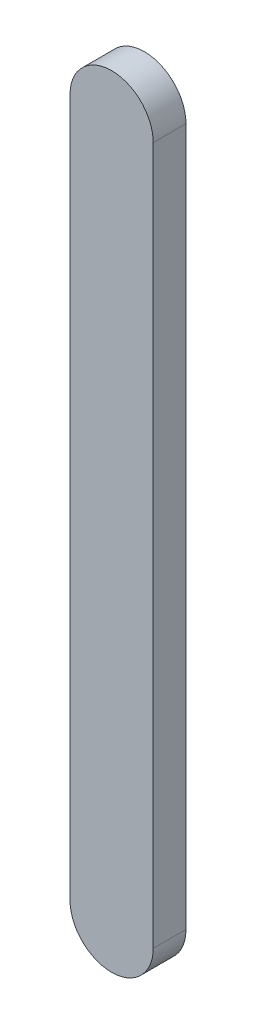
ISO-10303-21;
HEADER;
FILE_DESCRIPTION(('STEP AP214'),'2;1');
FILE_NAME('part.step','',(''),(''),'','','');
FILE_SCHEMA(('AUTOMOTIVE_DESIGN { 1 0 10303 214 1 1 1 1 }'));
ENDSEC;
DATA;
#1=APPLICATION_CONTEXT('core data for automotive mechanical design processes');
#2=APPLICATION_PROTOCOL_DEFINITION('international standard','automotive_design',2000,#1);
#3=PRODUCT_CONTEXT('',#1,'mechanical');
#4=PRODUCT('Part','Part','',(#3));
#5=PRODUCT_RELATED_PRODUCT_CATEGORY('part','',(#4));
#6=PRODUCT_DEFINITION_FORMATION('','',#4);
#7=PRODUCT_DEFINITION_CONTEXT('part definition',#1,'design');
#8=PRODUCT_DEFINITION('design','',#6,#7);
#9=PRODUCT_DEFINITION_SHAPE('','',#8);
#10=(LENGTH_UNIT() NAMED_UNIT(*) SI_UNIT(.MILLI.,.METRE.));
#11=(NAMED_UNIT(*) PLANE_ANGLE_UNIT() SI_UNIT($,.RADIAN.));
#12=(NAMED_UNIT(*) SI_UNIT($,.STERADIAN.) SOLID_ANGLE_UNIT());
#13=UNCERTAINTY_MEASURE_WITH_UNIT(LENGTH_MEASURE(1.E-05),#10,'distance_accuracy_value','');
#14=(GEOMETRIC_REPRESENTATION_CONTEXT(3) GLOBAL_UNCERTAINTY_ASSIGNED_CONTEXT((#13)) GLOBAL_UNIT_ASSIGNED_CONTEXT((#10,
#11,#12)) REPRESENTATION_CONTEXT('',''));
#15=CARTESIAN_POINT('',(0.,0.,0.));
#16=DIRECTION('',(0.,0.,1.));
#17=DIRECTION('',(1.,0.,0.));
#18=AXIS2_PLACEMENT_3D('',#15,#16,#17);
#19=CARTESIAN_POINT('',(111.9632,108.3745356,0.));
#20=DIRECTION('',(-1.,0.,0.));
#21=DIRECTION('',(0.,1.,0.));
#22=AXIS2_PLACEMENT_3D('',#19,#20,#21);
#23=PLANE('',#22);
#24=DIRECTION('',(0.,1.,0.));
#25=VECTOR('',#24,1.);
#26=CARTESIAN_POINT('',(111.9632,108.3745356,0.1999996));
#27=LINE('',#26,#25);
#28=CARTESIAN_POINT('',(111.9632,108.3745356,0.1999996));
#29=VERTEX_POINT('',#28);
#30=CARTESIAN_POINT('',(111.9632,112.6344712,0.1999996));
#31=VERTEX_POINT('',#30);
#32=EDGE_CURVE('E11',#29,#31,#27,.T.);
#33=ORIENTED_EDGE('',*,*,#32,.F.);
#34=DIRECTION('',(0.,0.,1.));
#35=VECTOR('',#34,1.);
#36=CARTESIAN_POINT('',(111.9632,108.3745356,0.));
#37=LINE('',#36,#35);
#38=CARTESIAN_POINT('',(111.9632,108.3745356,0.));
#39=VERTEX_POINT('',#38);
#40=EDGE_CURVE('E24',#39,#29,#37,.T.);
#41=ORIENTED_EDGE('',*,*,#40,.F.);
#42=DIRECTION('',(0.,1.,0.));
#43=VECTOR('',#42,1.);
#44=CARTESIAN_POINT('',(111.9632,108.3745356,0.));
#45=LINE('',#44,#43);
#46=CARTESIAN_POINT('',(111.9632,112.6344712,0.));
#47=VERTEX_POINT('',#46);
#48=EDGE_CURVE('E75',#39,#47,#45,.T.);
#49=ORIENTED_EDGE('',*,*,#48,.T.);
#50=DIRECTION('',(0.,0.,1.));
#51=VECTOR('',#50,1.);
#52=CARTESIAN_POINT('',(111.9632,112.6344712,0.));
#53=LINE('',#52,#51);
#54=EDGE_CURVE('E37',#47,#31,#53,.T.);
#55=ORIENTED_EDGE('',*,*,#54,.T.);
#56=EDGE_LOOP('',(#33,#41,#49,#55));
#57=FACE_BOUND('',#56,.T.);
#58=ADVANCED_FACE('F17',(#57),#23,.F.);
#59=CARTESIAN_POINT('',(111.7092,112.6344712,0.));
#60=DIRECTION('',(0.,0.,-1.));
#61=DIRECTION('',(1.,0.,0.));
#62=AXIS2_PLACEMENT_3D('',#59,#60,#61);
#63=CYLINDRICAL_SURFACE('',#62,0.253999999999995);
#64=CARTESIAN_POINT('',(111.7092,112.6344712,0.1999996));
#65=DIRECTION('',(0.,0.,1.));
#66=DIRECTION('',(1.,0.,0.));
#67=AXIS2_PLACEMENT_3D('',#64,#65,#66);
#68=CIRCLE('',#67,0.253999999999995);
#69=CARTESIAN_POINT('',(111.4552,112.6344712,0.1999996));
#70=VERTEX_POINT('',#69);
#71=EDGE_CURVE('E83',#31,#70,#68,.T.);
#72=ORIENTED_EDGE('',*,*,#71,.F.);
#73=ORIENTED_EDGE('',*,*,#54,.F.);
#74=CARTESIAN_POINT('',(111.7092,112.6344712,0.));
#75=DIRECTION('',(0.,0.,1.));
#76=DIRECTION('',(1.,0.,0.));
#77=AXIS2_PLACEMENT_3D('',#74,#75,#76);
#78=CIRCLE('',#77,0.253999999999995);
#79=CARTESIAN_POINT('',(111.4552,112.6344712,0.));
#80=VERTEX_POINT('',#79);
#81=EDGE_CURVE('E81',#47,#80,#78,.T.);
#82=ORIENTED_EDGE('',*,*,#81,.T.);
#83=DIRECTION('',(0.,0.,1.));
#84=VECTOR('',#83,1.);
#85=CARTESIAN_POINT('',(111.4552,112.6344712,0.));
#86=LINE('',#85,#84);
#87=EDGE_CURVE('E67',#80,#70,#86,.T.);
#88=ORIENTED_EDGE('',*,*,#87,.T.);
#89=EDGE_LOOP('',(#72,#73,#82,#88));
#90=FACE_BOUND('',#89,.T.);
#91=ADVANCED_FACE('F89',(#90),#63,.T.);
#92=CARTESIAN_POINT('',(111.4552,112.6344712,0.));
#93=DIRECTION('',(1.,0.,0.));
#94=DIRECTION('',(0.,-1.,0.));
#95=AXIS2_PLACEMENT_3D('',#92,#93,#94);
#96=PLANE('',#95);
#97=DIRECTION('',(0.,-1.,0.));
#98=VECTOR('',#97,1.);
#99=CARTESIAN_POINT('',(111.4552,112.6344712,0.1999996));
#100=LINE('',#99,#98);
#101=CARTESIAN_POINT('',(111.4552,108.3745356,0.1999996));
#102=VERTEX_POINT('',#101);
#103=EDGE_CURVE('E71',#70,#102,#100,.T.);
#104=ORIENTED_EDGE('',*,*,#103,.F.);
#105=ORIENTED_EDGE('',*,*,#87,.F.);
#106=DIRECTION('',(0.,-1.,0.));
#107=VECTOR('',#106,1.);
#108=CARTESIAN_POINT('',(111.4552,112.6344712,0.));
#109=LINE('',#108,#107);
#110=CARTESIAN_POINT('',(111.4552,108.3745356,0.));
#111=VERTEX_POINT('',#110);
#112=EDGE_CURVE('E63',#80,#111,#109,.T.);
#113=ORIENTED_EDGE('',*,*,#112,.T.);
#114=DIRECTION('',(0.,0.,1.));
#115=VECTOR('',#114,1.);
#116=CARTESIAN_POINT('',(111.4552,108.3745356,0.));
#117=LINE('',#116,#115);
#118=EDGE_CURVE('E53',#111,#102,#117,.T.);
#119=ORIENTED_EDGE('',*,*,#118,.T.);
#120=EDGE_LOOP('',(#104,#105,#113,#119));
#121=FACE_BOUND('',#120,.T.);
#122=ADVANCED_FACE('F66',(#121),#96,.F.);
#123=CARTESIAN_POINT('',(111.7092,108.3745356,0.));
#124=DIRECTION('',(0.,0.,-1.));
#125=DIRECTION('',(-1.,0.,0.));
#126=AXIS2_PLACEMENT_3D('',#123,#124,#125);
#127=CYLINDRICAL_SURFACE('',#126,0.253999999999995);
#128=CARTESIAN_POINT('',(111.7092,108.3745356,0.1999996));
#129=DIRECTION('',(0.,0.,1.));
#130=DIRECTION('',(-1.,0.,0.));
#131=AXIS2_PLACEMENT_3D('',#128,#129,#130);
#132=CIRCLE('',#131,0.253999999999995);
#133=EDGE_CURVE('E59',#102,#29,#132,.T.);
#134=ORIENTED_EDGE('',*,*,#133,.F.);
#135=ORIENTED_EDGE('',*,*,#118,.F.);
#136=CARTESIAN_POINT('',(111.7092,108.3745356,0.));
#137=DIRECTION('',(0.,0.,1.));
#138=DIRECTION('',(-1.,0.,0.));
#139=AXIS2_PLACEMENT_3D('',#136,#137,#138);
#140=CIRCLE('',#139,0.253999999999995);
#141=EDGE_CURVE('E57',#111,#39,#140,.T.);
#142=ORIENTED_EDGE('',*,*,#141,.T.);
#143=ORIENTED_EDGE('',*,*,#40,.T.);
#144=EDGE_LOOP('',(#134,#135,#142,#143));
#145=FACE_BOUND('',#144,.T.);
#146=ADVANCED_FACE('F55',(#145),#127,.T.);
#147=CARTESIAN_POINT('',(111.9632,108.3745356,0.));
#148=DIRECTION('',(0.,0.,-1.));
#149=DIRECTION('',(-1.,0.,0.));
#150=AXIS2_PLACEMENT_3D('',#147,#148,#149);
#151=PLANE('',#150);
#152=ORIENTED_EDGE('',*,*,#141,.F.);
#153=ORIENTED_EDGE('',*,*,#112,.F.);
#154=ORIENTED_EDGE('',*,*,#81,.F.);
#155=ORIENTED_EDGE('',*,*,#48,.F.);
#156=EDGE_LOOP('',(#152,#153,#154,#155));
#157=FACE_BOUND('',#156,.T.);
#158=ADVANCED_FACE('F74',(#157),#151,.T.);
#159=CARTESIAN_POINT('',(111.9632,108.3745356,0.1999996));
#160=DIRECTION('',(0.,0.,-1.));
#161=DIRECTION('',(-1.,0.,0.));
#162=AXIS2_PLACEMENT_3D('',#159,#160,#161);
#163=PLANE('',#162);
#164=ORIENTED_EDGE('',*,*,#32,.T.);
#165=ORIENTED_EDGE('',*,*,#71,.T.);
#166=ORIENTED_EDGE('',*,*,#103,.T.);
#167=ORIENTED_EDGE('',*,*,#133,.T.);
#168=EDGE_LOOP('',(#164,#165,#166,#167));
#169=FACE_BOUND('',#168,.T.);
#170=ADVANCED_FACE('F91',(#169),#163,.F.);
#171=CLOSED_SHELL('',(#58,#91,#122,#146,#158,#170));
#172=MANIFOLD_SOLID_BREP('B1',#171);
#173=ADVANCED_BREP_SHAPE_REPRESENTATION('',(#18,#172),#14);
#174=SHAPE_DEFINITION_REPRESENTATION(#9,#173);
ENDSEC;
END-ISO-10303-21;
